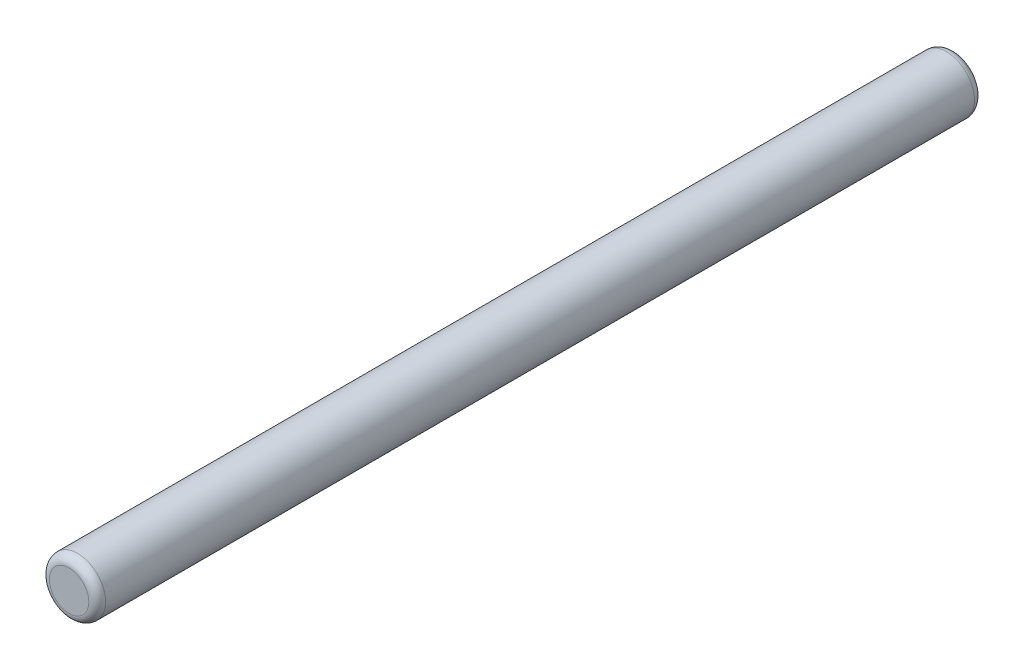
ISO-10303-21;
HEADER;
FILE_DESCRIPTION(('STEP AP214'),'2;1');
FILE_NAME('part.step','',(''),(''),'','','');
FILE_SCHEMA(('AUTOMOTIVE_DESIGN { 1 0 10303 214 1 1 1 1 }'));
ENDSEC;
DATA;
#1=APPLICATION_CONTEXT('core data for automotive mechanical design processes');
#2=APPLICATION_PROTOCOL_DEFINITION('international standard','automotive_design',2000,#1);
#3=PRODUCT_CONTEXT('',#1,'mechanical');
#4=PRODUCT('Part','Part','',(#3));
#5=PRODUCT_RELATED_PRODUCT_CATEGORY('part','',(#4));
#6=PRODUCT_DEFINITION_FORMATION('','',#4);
#7=PRODUCT_DEFINITION_CONTEXT('part definition',#1,'design');
#8=PRODUCT_DEFINITION('design','',#6,#7);
#9=PRODUCT_DEFINITION_SHAPE('','',#8);
#10=(LENGTH_UNIT() NAMED_UNIT(*) SI_UNIT(.MILLI.,.METRE.));
#11=(NAMED_UNIT(*) PLANE_ANGLE_UNIT() SI_UNIT($,.RADIAN.));
#12=(NAMED_UNIT(*) SI_UNIT($,.STERADIAN.) SOLID_ANGLE_UNIT());
#13=UNCERTAINTY_MEASURE_WITH_UNIT(LENGTH_MEASURE(1.E-05),#10,'distance_accuracy_value','');
#14=(GEOMETRIC_REPRESENTATION_CONTEXT(3) GLOBAL_UNCERTAINTY_ASSIGNED_CONTEXT((#13)) GLOBAL_UNIT_ASSIGNED_CONTEXT((#10,
#11,#12)) REPRESENTATION_CONTEXT('',''));
#15=CARTESIAN_POINT('',(0.,0.,0.));
#16=DIRECTION('',(0.,0.,1.));
#17=DIRECTION('',(1.,0.,0.));
#18=AXIS2_PLACEMENT_3D('',#15,#16,#17);
#19=CARTESIAN_POINT('',(0.,0.,15.75));
#20=DIRECTION('',(0.,0.,-1.));
#21=DIRECTION('',(-1.,0.,0.));
#22=AXIS2_PLACEMENT_3D('',#19,#20,#21);
#23=CYLINDRICAL_SURFACE('',#22,0.5);
#24=CARTESIAN_POINT('',(0.,0.,0.150000000000001));
#25=DIRECTION('',(0.,0.,1.));
#26=DIRECTION('',(1.,0.,0.));
#27=AXIS2_PLACEMENT_3D('',#24,#25,#26);
#28=CIRCLE('',#27,0.5);
#29=CARTESIAN_POINT('',(0.5,0.,0.150000000000001));
#30=VERTEX_POINT('',#29);
#31=EDGE_CURVE('E42',#30,#30,#28,.T.);
#32=ORIENTED_EDGE('',*,*,#31,.T.);
#33=EDGE_LOOP('',(#32));
#34=FACE_BOUND('',#33,.T.);
#35=CARTESIAN_POINT('',(0.,0.,15.6));
#36=DIRECTION('',(0.,0.,1.));
#37=DIRECTION('',(1.,0.,0.));
#38=AXIS2_PLACEMENT_3D('',#35,#36,#37);
#39=CIRCLE('',#38,0.5);
#40=CARTESIAN_POINT('',(0.5,0.,15.6));
#41=VERTEX_POINT('',#40);
#42=EDGE_CURVE('E46',#41,#41,#39,.F.);
#43=ORIENTED_EDGE('',*,*,#42,.T.);
#44=EDGE_LOOP('',(#43));
#45=FACE_BOUND('',#44,.T.);
#46=ADVANCED_FACE('F31',(#34,#45),#23,.T.);
#47=CARTESIAN_POINT('',(0.,0.,15.75));
#48=DIRECTION('',(0.,0.,1.));
#49=DIRECTION('',(1.,0.,0.));
#50=AXIS2_PLACEMENT_3D('',#47,#48,#49);
#51=PLANE('',#50);
#52=CARTESIAN_POINT('',(0.,0.,15.75));
#53=DIRECTION('',(0.,0.,1.));
#54=DIRECTION('',(1.,0.,0.));
#55=AXIS2_PLACEMENT_3D('',#52,#53,#54);
#56=CIRCLE('',#55,0.35);
#57=CARTESIAN_POINT('',(0.35,0.,15.75));
#58=VERTEX_POINT('',#57);
#59=EDGE_CURVE('E10',#58,#58,#56,.T.);
#60=ORIENTED_EDGE('',*,*,#59,.T.);
#61=EDGE_LOOP('',(#60));
#62=FACE_BOUND('',#61,.T.);
#63=ADVANCED_FACE('F62',(#62),#51,.T.);
#64=CARTESIAN_POINT('',(0.,0.,0.));
#65=DIRECTION('',(0.,0.,1.));
#66=DIRECTION('',(1.,0.,0.));
#67=AXIS2_PLACEMENT_3D('',#64,#65,#66);
#68=PLANE('',#67);
#69=CARTESIAN_POINT('',(0.,0.,0.));
#70=DIRECTION('',(0.,0.,1.));
#71=DIRECTION('',(1.,0.,0.));
#72=AXIS2_PLACEMENT_3D('',#69,#70,#71);
#73=CIRCLE('',#72,0.35);
#74=CARTESIAN_POINT('',(0.35,0.,0.));
#75=VERTEX_POINT('',#74);
#76=EDGE_CURVE('E38',#75,#75,#73,.F.);
#77=ORIENTED_EDGE('',*,*,#76,.T.);
#78=EDGE_LOOP('',(#77));
#79=FACE_BOUND('',#78,.T.);
#80=ADVANCED_FACE('F59',(#79),#68,.F.);
#81=CARTESIAN_POINT('',(0.,0.,0.150000000000001));
#82=DIRECTION('',(0.,0.,1.));
#83=DIRECTION('',(1.,0.,0.));
#84=AXIS2_PLACEMENT_3D('',#81,#82,#83);
#85=TOROIDAL_SURFACE('',#84,0.35,0.15);
#86=ORIENTED_EDGE('',*,*,#76,.F.);
#87=EDGE_LOOP('',(#86));
#88=FACE_BOUND('',#87,.T.);
#89=ORIENTED_EDGE('',*,*,#31,.F.);
#90=EDGE_LOOP('',(#89));
#91=FACE_BOUND('',#90,.T.);
#92=ADVANCED_FACE('F55',(#88,#91),#85,.T.);
#93=CARTESIAN_POINT('',(0.,0.,15.6));
#94=DIRECTION('',(0.,0.,1.));
#95=DIRECTION('',(1.,0.,0.));
#96=AXIS2_PLACEMENT_3D('',#93,#94,#95);
#97=TOROIDAL_SURFACE('',#96,0.35,0.15);
#98=ORIENTED_EDGE('',*,*,#42,.F.);
#99=EDGE_LOOP('',(#98));
#100=FACE_BOUND('',#99,.T.);
#101=ORIENTED_EDGE('',*,*,#59,.F.);
#102=EDGE_LOOP('',(#101));
#103=FACE_BOUND('',#102,.T.);
#104=ADVANCED_FACE('F33',(#100,#103),#97,.T.);
#105=CLOSED_SHELL('',(#46,#63,#80,#92,#104));
#106=MANIFOLD_SOLID_BREP('B2',#105);
#107=ADVANCED_BREP_SHAPE_REPRESENTATION('',(#18,#106),#14);
#108=SHAPE_DEFINITION_REPRESENTATION(#9,#107);
ENDSEC;
END-ISO-10303-21;
